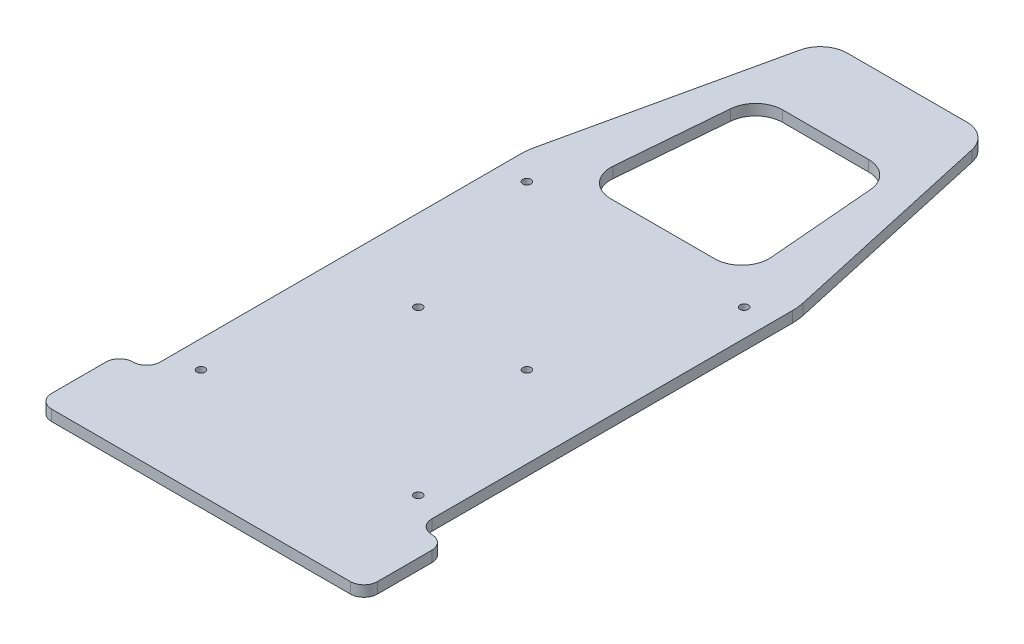
ISO-10303-21;
HEADER;
FILE_DESCRIPTION(('STEP AP214'),'2;1');
FILE_NAME('part.step','',(''),(''),'','','');
FILE_SCHEMA(('AUTOMOTIVE_DESIGN { 1 0 10303 214 1 1 1 1 }'));
ENDSEC;
DATA;
#1=APPLICATION_CONTEXT('core data for automotive mechanical design processes');
#2=APPLICATION_PROTOCOL_DEFINITION('international standard','automotive_design',2000,#1);
#3=PRODUCT_CONTEXT('',#1,'mechanical');
#4=PRODUCT('Part','Part','',(#3));
#5=PRODUCT_RELATED_PRODUCT_CATEGORY('part','',(#4));
#6=PRODUCT_DEFINITION_FORMATION('','',#4);
#7=PRODUCT_DEFINITION_CONTEXT('part definition',#1,'design');
#8=PRODUCT_DEFINITION('design','',#6,#7);
#9=PRODUCT_DEFINITION_SHAPE('','',#8);
#10=(LENGTH_UNIT() NAMED_UNIT(*) SI_UNIT(.MILLI.,.METRE.));
#11=(NAMED_UNIT(*) PLANE_ANGLE_UNIT() SI_UNIT($,.RADIAN.));
#12=(NAMED_UNIT(*) SI_UNIT($,.STERADIAN.) SOLID_ANGLE_UNIT());
#13=UNCERTAINTY_MEASURE_WITH_UNIT(LENGTH_MEASURE(1.E-05),#10,'distance_accuracy_value','');
#14=(GEOMETRIC_REPRESENTATION_CONTEXT(3) GLOBAL_UNCERTAINTY_ASSIGNED_CONTEXT((#13)) GLOBAL_UNIT_ASSIGNED_CONTEXT((#10,
#11,#12)) REPRESENTATION_CONTEXT('',''));
#15=CARTESIAN_POINT('',(0.,0.,0.));
#16=DIRECTION('',(0.,0.,1.));
#17=DIRECTION('',(1.,0.,0.));
#18=AXIS2_PLACEMENT_3D('',#15,#16,#17);
#19=CARTESIAN_POINT('',(0.,4.,0.));
#20=DIRECTION('',(0.,-1.,0.));
#21=DIRECTION('',(0.,0.,-1.));
#22=AXIS2_PLACEMENT_3D('',#19,#20,#21);
#23=PLANE('',#22);
#24=CARTESIAN_POINT('',(411.18527663098,4.,237.117267335242));
#25=DIRECTION('',(0.,1.,0.));
#26=DIRECTION('',(0.,0.,1.));
#27=AXIS2_PLACEMENT_3D('',#24,#25,#26);
#28=CIRCLE('',#27,1.50000000000009);
#29=CARTESIAN_POINT('',(411.18527663098,4.,238.617267335242));
#30=VERTEX_POINT('',#29);
#31=EDGE_CURVE('E438',#30,#30,#28,.T.);
#32=ORIENTED_EDGE('',*,*,#31,.F.);
#33=EDGE_LOOP('',(#32));
#34=FACE_BOUND('',#33,.T.);
#35=CARTESIAN_POINT('',(371.18527663098,4.,237.117267335242));
#36=DIRECTION('',(0.,1.,0.));
#37=DIRECTION('',(0.,0.,1.));
#38=AXIS2_PLACEMENT_3D('',#35,#36,#37);
#39=CIRCLE('',#38,1.50000000000002);
#40=CARTESIAN_POINT('',(371.18527663098,4.,238.617267335242));
#41=VERTEX_POINT('',#40);
#42=EDGE_CURVE('E432',#41,#41,#39,.T.);
#43=ORIENTED_EDGE('',*,*,#42,.F.);
#44=EDGE_LOOP('',(#43));
#45=FACE_BOUND('',#44,.T.);
#46=CARTESIAN_POINT('',(351.18527663098,4.,297.117267335242));
#47=DIRECTION('',(0.,1.,0.));
#48=DIRECTION('',(0.,0.,1.));
#49=AXIS2_PLACEMENT_3D('',#46,#47,#48);
#50=CIRCLE('',#49,1.50000000000002);
#51=CARTESIAN_POINT('',(351.18527663098,4.,298.617267335242));
#52=VERTEX_POINT('',#51);
#53=EDGE_CURVE('E426',#52,#52,#50,.T.);
#54=ORIENTED_EDGE('',*,*,#53,.F.);
#55=EDGE_LOOP('',(#54));
#56=FACE_BOUND('',#55,.T.);
#57=CARTESIAN_POINT('',(431.18527663098,4.,297.117267335242));
#58=DIRECTION('',(0.,1.,0.));
#59=DIRECTION('',(0.,0.,1.));
#60=AXIS2_PLACEMENT_3D('',#57,#58,#59);
#61=CIRCLE('',#60,1.49999999999997);
#62=CARTESIAN_POINT('',(431.18527663098,4.,298.617267335242));
#63=VERTEX_POINT('',#62);
#64=EDGE_CURVE('E420',#63,#63,#61,.T.);
#65=ORIENTED_EDGE('',*,*,#64,.F.);
#66=EDGE_LOOP('',(#65));
#67=FACE_BOUND('',#66,.T.);
#68=CARTESIAN_POINT('',(431.18527663098,4.,177.117267335242));
#69=DIRECTION('',(0.,1.,0.));
#70=DIRECTION('',(0.,0.,1.));
#71=AXIS2_PLACEMENT_3D('',#68,#69,#70);
#72=CIRCLE('',#71,1.49999999999996);
#73=CARTESIAN_POINT('',(431.18527663098,4.,178.617267335242));
#74=VERTEX_POINT('',#73);
#75=EDGE_CURVE('E415',#74,#74,#72,.T.);
#76=ORIENTED_EDGE('',*,*,#75,.F.);
#77=EDGE_LOOP('',(#76));
#78=FACE_BOUND('',#77,.T.);
#79=CARTESIAN_POINT('',(351.18527663098,4.,177.117267335242));
#80=DIRECTION('',(0.,1.,0.));
#81=DIRECTION('',(0.,0.,1.));
#82=AXIS2_PLACEMENT_3D('',#79,#80,#81);
#83=CIRCLE('',#82,1.50000000000002);
#84=CARTESIAN_POINT('',(351.18527663098,4.,178.617267335242));
#85=VERTEX_POINT('',#84);
#86=EDGE_CURVE('E370',#85,#85,#83,.T.);
#87=ORIENTED_EDGE('',*,*,#86,.F.);
#88=EDGE_LOOP('',(#87));
#89=FACE_BOUND('',#88,.T.);
#90=DIRECTION('',(-0.216930457818656,0.,-0.976187060183953));
#91=VECTOR('',#90,1.);
#92=CARTESIAN_POINT('',(441.18527663098,4.,167.117267335242));
#93=LINE('',#92,#91);
#94=CARTESIAN_POINT('',(440.709017834659,4.,164.974102751798));
#95=VERTEX_POINT('',#94);
#96=CARTESIAN_POINT('',(422.92543116916,4.,84.9479627570553));
#97=VERTEX_POINT('',#96);
#98=EDGE_CURVE('E237',#95,#97,#93,.T.);
#99=ORIENTED_EDGE('',*,*,#98,.T.);
#100=CARTESIAN_POINT('',(413.163560567321,4.,87.1172673352419));
#101=DIRECTION('',(0.,-1.,0.));
#102=DIRECTION('',(0.,0.,-1.));
#103=AXIS2_PLACEMENT_3D('',#100,#101,#102);
#104=CIRCLE('',#103,10.);
#105=CARTESIAN_POINT('',(413.163560567321,4.,77.1172673352419));
#106=VERTEX_POINT('',#105);
#107=EDGE_CURVE('E41',#97,#106,#104,.F.);
#108=ORIENTED_EDGE('',*,*,#107,.T.);
#109=DIRECTION('',(-1.,0.,0.));
#110=VECTOR('',#109,1.);
#111=CARTESIAN_POINT('',(361.18527663098,4.,77.1172673352419));
#112=LINE('',#111,#110);
#113=CARTESIAN_POINT('',(369.206992694638,4.,77.1172673352419));
#114=VERTEX_POINT('',#113);
#115=EDGE_CURVE('E240',#106,#114,#112,.T.);
#116=ORIENTED_EDGE('',*,*,#115,.T.);
#117=CARTESIAN_POINT('',(369.206992694638,4.,87.1172673352419));
#118=DIRECTION('',(0.,-1.,0.));
#119=DIRECTION('',(0.,0.,-1.));
#120=AXIS2_PLACEMENT_3D('',#117,#118,#119);
#121=CIRCLE('',#120,10.);
#122=CARTESIAN_POINT('',(359.445122092799,4.,84.9479627570553));
#123=VERTEX_POINT('',#122);
#124=EDGE_CURVE('E48',#114,#123,#121,.F.);
#125=ORIENTED_EDGE('',*,*,#124,.T.);
#126=DIRECTION('',(-0.216930457818656,0.,0.976187060183953));
#127=VECTOR('',#126,1.);
#128=CARTESIAN_POINT('',(341.18527663098,4.,167.117267335242));
#129=LINE('',#128,#127);
#130=CARTESIAN_POINT('',(341.661535427301,4.,164.974102751798));
#131=VERTEX_POINT('',#130);
#132=EDGE_CURVE('E363',#123,#131,#129,.T.);
#133=ORIENTED_EDGE('',*,*,#132,.T.);
#134=CARTESIAN_POINT('',(361.18527663098,4.,169.312711908171));
#135=DIRECTION('',(0.,-1.,0.));
#136=DIRECTION('',(0.,0.,-1.));
#137=AXIS2_PLACEMENT_3D('',#134,#135,#136);
#138=CIRCLE('',#137,20.);
#139=CARTESIAN_POINT('',(341.18527663098,4.,169.312711908171));
#140=VERTEX_POINT('',#139);
#141=EDGE_CURVE('E301',#131,#140,#138,.F.);
#142=ORIENTED_EDGE('',*,*,#141,.T.);
#143=DIRECTION('',(0.,0.,1.));
#144=VECTOR('',#143,1.);
#145=CARTESIAN_POINT('',(341.18527663098,4.,307.117267335242));
#146=LINE('',#145,#144);
#147=CARTESIAN_POINT('',(341.18527663098,4.,302.117267335242));
#148=VERTEX_POINT('',#147);
#149=EDGE_CURVE('E411',#140,#148,#146,.T.);
#150=ORIENTED_EDGE('',*,*,#149,.T.);
#151=CARTESIAN_POINT('',(336.18527663098,4.,302.117267335242));
#152=DIRECTION('',(0.,-1.,0.));
#153=DIRECTION('',(0.,0.,-1.));
#154=AXIS2_PLACEMENT_3D('',#151,#152,#153);
#155=CIRCLE('',#154,5.);
#156=CARTESIAN_POINT('',(336.18527663098,4.,307.117267335242));
#157=VERTEX_POINT('',#156);
#158=EDGE_CURVE('E282',#148,#157,#155,.T.);
#159=ORIENTED_EDGE('',*,*,#158,.T.);
#160=CARTESIAN_POINT('',(336.18527663098,4.,312.117267335242));
#161=DIRECTION('',(0.,-1.,0.));
#162=DIRECTION('',(0.,0.,-1.));
#163=AXIS2_PLACEMENT_3D('',#160,#161,#162);
#164=CIRCLE('',#163,5.);
#165=CARTESIAN_POINT('',(331.18527663098,4.,312.117267335242));
#166=VERTEX_POINT('',#165);
#167=EDGE_CURVE('E267',#157,#166,#164,.F.);
#168=ORIENTED_EDGE('',*,*,#167,.T.);
#169=DIRECTION('',(0.,0.,1.));
#170=VECTOR('',#169,1.);
#171=CARTESIAN_POINT('',(331.18527663098,4.,337.117267335242));
#172=LINE('',#171,#170);
#173=CARTESIAN_POINT('',(331.18527663098,4.,332.117267335242));
#174=VERTEX_POINT('',#173);
#175=EDGE_CURVE('E406',#166,#174,#172,.T.);
#176=ORIENTED_EDGE('',*,*,#175,.T.);
#177=CARTESIAN_POINT('',(336.18527663098,4.,332.117267335242));
#178=DIRECTION('',(0.,-1.,0.));
#179=DIRECTION('',(0.,0.,-1.));
#180=AXIS2_PLACEMENT_3D('',#177,#178,#179);
#181=CIRCLE('',#180,5.);
#182=CARTESIAN_POINT('',(336.18527663098,4.,337.117267335242));
#183=VERTEX_POINT('',#182);
#184=EDGE_CURVE('E265',#174,#183,#181,.F.);
#185=ORIENTED_EDGE('',*,*,#184,.T.);
#186=DIRECTION('',(1.,0.,0.));
#187=VECTOR('',#186,1.);
#188=CARTESIAN_POINT('',(391.18527663098,4.,337.117267335242));
#189=LINE('',#188,#187);
#190=CARTESIAN_POINT('',(446.18527663098,4.,337.117267335242));
#191=VERTEX_POINT('',#190);
#192=EDGE_CURVE('E401',#183,#191,#189,.T.);
#193=ORIENTED_EDGE('',*,*,#192,.T.);
#194=CARTESIAN_POINT('',(446.18527663098,4.,332.117267335242));
#195=DIRECTION('',(0.,-1.,0.));
#196=DIRECTION('',(0.,0.,-1.));
#197=AXIS2_PLACEMENT_3D('',#194,#195,#196);
#198=CIRCLE('',#197,5.);
#199=CARTESIAN_POINT('',(451.18527663098,4.,332.117267335242));
#200=VERTEX_POINT('',#199);
#201=EDGE_CURVE('E263',#191,#200,#198,.F.);
#202=ORIENTED_EDGE('',*,*,#201,.T.);
#203=DIRECTION('',(0.,0.,-1.));
#204=VECTOR('',#203,1.);
#205=CARTESIAN_POINT('',(451.18527663098,4.,337.117267335242));
#206=LINE('',#205,#204);
#207=CARTESIAN_POINT('',(451.18527663098,4.,312.117267335242));
#208=VERTEX_POINT('',#207);
#209=EDGE_CURVE('E399',#200,#208,#206,.T.);
#210=ORIENTED_EDGE('',*,*,#209,.T.);
#211=CARTESIAN_POINT('',(446.18527663098,4.,312.117267335242));
#212=DIRECTION('',(0.,-1.,0.));
#213=DIRECTION('',(0.,0.,-1.));
#214=AXIS2_PLACEMENT_3D('',#211,#212,#213);
#215=CIRCLE('',#214,5.);
#216=CARTESIAN_POINT('',(446.18527663098,4.,307.117267335242));
#217=VERTEX_POINT('',#216);
#218=EDGE_CURVE('E261',#208,#217,#215,.F.);
#219=ORIENTED_EDGE('',*,*,#218,.T.);
#220=CARTESIAN_POINT('',(446.18527663098,4.,302.117267335242));
#221=DIRECTION('',(0.,-1.,0.));
#222=DIRECTION('',(0.,0.,-1.));
#223=AXIS2_PLACEMENT_3D('',#220,#221,#222);
#224=CIRCLE('',#223,5.);
#225=CARTESIAN_POINT('',(441.18527663098,4.,302.117267335242));
#226=VERTEX_POINT('',#225);
#227=EDGE_CURVE('E219',#217,#226,#224,.T.);
#228=ORIENTED_EDGE('',*,*,#227,.T.);
#229=DIRECTION('',(0.,0.,-1.));
#230=VECTOR('',#229,1.);
#231=CARTESIAN_POINT('',(441.18527663098,4.,307.117267335242));
#232=LINE('',#231,#230);
#233=CARTESIAN_POINT('',(441.18527663098,4.,169.312711908171));
#234=VERTEX_POINT('',#233);
#235=EDGE_CURVE('E229',#226,#234,#232,.T.);
#236=ORIENTED_EDGE('',*,*,#235,.T.);
#237=CARTESIAN_POINT('',(421.18527663098,4.,169.312711908171));
#238=DIRECTION('',(0.,-1.,0.));
#239=DIRECTION('',(0.,0.,-1.));
#240=AXIS2_PLACEMENT_3D('',#237,#238,#239);
#241=CIRCLE('',#240,20.);
#242=EDGE_CURVE('E299',#234,#95,#241,.F.);
#243=ORIENTED_EDGE('',*,*,#242,.T.);
#244=EDGE_LOOP('',(#99,#108,#116,#125,#133,#142,#150,#159,#168,#176,#185,#193,#202,#210,#219,
#228,#236,#243));
#245=FACE_BOUND('',#244,.T.);
#246=DIRECTION('',(-1.,0.,0.));
#247=VECTOR('',#246,1.);
#248=CARTESIAN_POINT('',(366.18527663098,4.,107.117267335242));
#249=LINE('',#248,#247);
#250=CARTESIAN_POINT('',(406.983947815319,4.,107.117267335242));
#251=VERTEX_POINT('',#250);
#252=CARTESIAN_POINT('',(375.38660544664,4.,107.117267335242));
#253=VERTEX_POINT('',#252);
#254=EDGE_CURVE('E450',#251,#253,#249,.T.);
#255=ORIENTED_EDGE('',*,*,#254,.F.);
#256=CARTESIAN_POINT('',(406.983947815319,4.,117.117267335242));
#257=DIRECTION('',(0.,-1.,0.));
#258=DIRECTION('',(0.,0.,-1.));
#259=AXIS2_PLACEMENT_3D('',#256,#257,#258);
#260=CIRCLE('',#259,10.);
#261=CARTESIAN_POINT('',(416.949405397768,4.,116.286812536705));
#262=VERTEX_POINT('',#261);
#263=EDGE_CURVE('E334',#251,#262,#260,.T.);
#264=ORIENTED_EDGE('',*,*,#263,.T.);
#265=DIRECTION('',(-0.0830454798537391,0.,-0.99654575824488));
#266=VECTOR('',#265,1.);
#267=CARTESIAN_POINT('',(421.18527663098,4.,167.117267335242));
#268=LINE('',#267,#266);
#269=CARTESIAN_POINT('',(420.282738731102,4.,156.286812536705));
#270=VERTEX_POINT('',#269);
#271=EDGE_CURVE('E444',#270,#262,#268,.T.);
#272=ORIENTED_EDGE('',*,*,#271,.F.);
#273=CARTESIAN_POINT('',(410.317281148653,4.,157.117267335242));
#274=DIRECTION('',(0.,-1.,0.));
#275=DIRECTION('',(0.,0.,-1.));
#276=AXIS2_PLACEMENT_3D('',#273,#274,#275);
#277=CIRCLE('',#276,10.);
#278=CARTESIAN_POINT('',(410.317281148653,4.,167.117267335242));
#279=VERTEX_POINT('',#278);
#280=EDGE_CURVE('E338',#270,#279,#277,.T.);
#281=ORIENTED_EDGE('',*,*,#280,.T.);
#282=DIRECTION('',(1.,0.,0.));
#283=VECTOR('',#282,1.);
#284=CARTESIAN_POINT('',(421.18527663098,4.,167.117267335242));
#285=LINE('',#284,#283);
#286=CARTESIAN_POINT('',(372.053272113307,4.,167.117267335242));
#287=VERTEX_POINT('',#286);
#288=EDGE_CURVE('E461',#287,#279,#285,.T.);
#289=ORIENTED_EDGE('',*,*,#288,.F.);
#290=CARTESIAN_POINT('',(372.053272113307,4.,157.117267335242));
#291=DIRECTION('',(0.,-1.,0.));
#292=DIRECTION('',(0.,0.,-1.));
#293=AXIS2_PLACEMENT_3D('',#290,#291,#292);
#294=CIRCLE('',#293,10.);
#295=CARTESIAN_POINT('',(362.087814530858,4.,156.286812536705));
#296=VERTEX_POINT('',#295);
#297=EDGE_CURVE('E342',#287,#296,#294,.T.);
#298=ORIENTED_EDGE('',*,*,#297,.T.);
#299=DIRECTION('',(-0.0830454798537391,0.,0.99654575824488));
#300=VECTOR('',#299,1.);
#301=CARTESIAN_POINT('',(361.18527663098,4.,167.117267335242));
#302=LINE('',#301,#300);
#303=CARTESIAN_POINT('',(365.421147864191,4.,116.286812536705));
#304=VERTEX_POINT('',#303);
#305=EDGE_CURVE('E464',#304,#296,#302,.T.);
#306=ORIENTED_EDGE('',*,*,#305,.F.);
#307=CARTESIAN_POINT('',(375.38660544664,4.,117.117267335242));
#308=DIRECTION('',(0.,-1.,0.));
#309=DIRECTION('',(0.,0.,-1.));
#310=AXIS2_PLACEMENT_3D('',#307,#308,#309);
#311=CIRCLE('',#310,10.);
#312=EDGE_CURVE('E330',#304,#253,#311,.T.);
#313=ORIENTED_EDGE('',*,*,#312,.T.);
#314=EDGE_LOOP('',(#255,#264,#272,#281,#289,#298,#306,#313));
#315=FACE_BOUND('',#314,.T.);
#316=ADVANCED_FACE('F33',(#34,#45,#56,#67,#78,#89,#245,#315),#23,.F.);
#317=CARTESIAN_POINT('',(0.,0.,0.));
#318=DIRECTION('',(0.,-1.,0.));
#319=DIRECTION('',(0.,0.,-1.));
#320=AXIS2_PLACEMENT_3D('',#317,#318,#319);
#321=PLANE('',#320);
#322=CARTESIAN_POINT('',(371.18527663098,0.,237.117267335242));
#323=DIRECTION('',(0.,1.,0.));
#324=DIRECTION('',(0.,0.,1.));
#325=AXIS2_PLACEMENT_3D('',#322,#323,#324);
#326=CIRCLE('',#325,1.50000000000002);
#327=CARTESIAN_POINT('',(371.18527663098,0.,238.617267335242));
#328=VERTEX_POINT('',#327);
#329=EDGE_CURVE('E435',#328,#328,#326,.T.);
#330=ORIENTED_EDGE('',*,*,#329,.T.);
#331=EDGE_LOOP('',(#330));
#332=FACE_BOUND('',#331,.T.);
#333=CARTESIAN_POINT('',(431.18527663098,0.,297.117267335242));
#334=DIRECTION('',(0.,1.,0.));
#335=DIRECTION('',(0.,0.,1.));
#336=AXIS2_PLACEMENT_3D('',#333,#334,#335);
#337=CIRCLE('',#336,1.49999999999997);
#338=CARTESIAN_POINT('',(431.18527663098,0.,298.617267335242));
#339=VERTEX_POINT('',#338);
#340=EDGE_CURVE('E423',#339,#339,#337,.T.);
#341=ORIENTED_EDGE('',*,*,#340,.T.);
#342=EDGE_LOOP('',(#341));
#343=FACE_BOUND('',#342,.T.);
#344=CARTESIAN_POINT('',(351.18527663098,0.,177.117267335242));
#345=DIRECTION('',(0.,1.,0.));
#346=DIRECTION('',(0.,0.,1.));
#347=AXIS2_PLACEMENT_3D('',#344,#345,#346);
#348=CIRCLE('',#347,1.50000000000002);
#349=CARTESIAN_POINT('',(351.18527663098,0.,178.617267335242));
#350=VERTEX_POINT('',#349);
#351=EDGE_CURVE('E375',#350,#350,#348,.T.);
#352=ORIENTED_EDGE('',*,*,#351,.T.);
#353=EDGE_LOOP('',(#352));
#354=FACE_BOUND('',#353,.T.);
#355=DIRECTION('',(-1.,0.,0.));
#356=VECTOR('',#355,1.);
#357=CARTESIAN_POINT('',(361.18527663098,0.,77.1172673352419));
#358=LINE('',#357,#356);
#359=CARTESIAN_POINT('',(413.163560567321,0.,77.1172673352419));
#360=VERTEX_POINT('',#359);
#361=CARTESIAN_POINT('',(369.206992694638,0.,77.1172673352419));
#362=VERTEX_POINT('',#361);
#363=EDGE_CURVE('E367',#360,#362,#358,.T.);
#364=ORIENTED_EDGE('',*,*,#363,.F.);
#365=CARTESIAN_POINT('',(413.163560567321,0.,87.1172673352419));
#366=DIRECTION('',(0.,-1.,0.));
#367=DIRECTION('',(0.,0.,-1.));
#368=AXIS2_PLACEMENT_3D('',#365,#366,#367);
#369=CIRCLE('',#368,10.);
#370=CARTESIAN_POINT('',(422.92543116916,0.,84.9479627570553));
#371=VERTEX_POINT('',#370);
#372=EDGE_CURVE('E351',#360,#371,#369,.T.);
#373=ORIENTED_EDGE('',*,*,#372,.T.);
#374=DIRECTION('',(-0.216930457818656,0.,-0.976187060183953));
#375=VECTOR('',#374,1.);
#376=CARTESIAN_POINT('',(441.18527663098,0.,167.117267335242));
#377=LINE('',#376,#375);
#378=CARTESIAN_POINT('',(440.709017834659,0.,164.974102751798));
#379=VERTEX_POINT('',#378);
#380=EDGE_CURVE('E366',#379,#371,#377,.T.);
#381=ORIENTED_EDGE('',*,*,#380,.F.);
#382=CARTESIAN_POINT('',(421.18527663098,0.,169.312711908171));
#383=DIRECTION('',(0.,-1.,0.));
#384=DIRECTION('',(0.,0.,-1.));
#385=AXIS2_PLACEMENT_3D('',#382,#383,#384);
#386=CIRCLE('',#385,20.);
#387=CARTESIAN_POINT('',(441.18527663098,0.,169.312711908171));
#388=VERTEX_POINT('',#387);
#389=EDGE_CURVE('E236',#379,#388,#386,.T.);
#390=ORIENTED_EDGE('',*,*,#389,.T.);
#391=DIRECTION('',(0.,0.,-1.));
#392=VECTOR('',#391,1.);
#393=CARTESIAN_POINT('',(441.18527663098,0.,307.117267335242));
#394=LINE('',#393,#392);
#395=CARTESIAN_POINT('',(441.18527663098,0.,302.117267335242));
#396=VERTEX_POINT('',#395);
#397=EDGE_CURVE('E226',#396,#388,#394,.T.);
#398=ORIENTED_EDGE('',*,*,#397,.F.);
#399=CARTESIAN_POINT('',(446.18527663098,0.,302.117267335242));
#400=DIRECTION('',(0.,-1.,0.));
#401=DIRECTION('',(0.,0.,-1.));
#402=AXIS2_PLACEMENT_3D('',#399,#400,#401);
#403=CIRCLE('',#402,5.);
#404=CARTESIAN_POINT('',(446.18527663098,0.,307.117267335242));
#405=VERTEX_POINT('',#404);
#406=EDGE_CURVE('E209',#396,#405,#403,.F.);
#407=ORIENTED_EDGE('',*,*,#406,.T.);
#408=CARTESIAN_POINT('',(446.18527663098,0.,312.117267335242));
#409=DIRECTION('',(0.,-1.,0.));
#410=DIRECTION('',(0.,0.,-1.));
#411=AXIS2_PLACEMENT_3D('',#408,#409,#410);
#412=CIRCLE('',#411,5.);
#413=CARTESIAN_POINT('',(451.18527663098,0.,312.117267335242));
#414=VERTEX_POINT('',#413);
#415=EDGE_CURVE('E253',#405,#414,#412,.T.);
#416=ORIENTED_EDGE('',*,*,#415,.T.);
#417=DIRECTION('',(0.,0.,-1.));
#418=VECTOR('',#417,1.);
#419=CARTESIAN_POINT('',(451.18527663098,0.,337.117267335242));
#420=LINE('',#419,#418);
#421=CARTESIAN_POINT('',(451.18527663098,0.,332.117267335242));
#422=VERTEX_POINT('',#421);
#423=EDGE_CURVE('E238',#422,#414,#420,.T.);
#424=ORIENTED_EDGE('',*,*,#423,.F.);
#425=CARTESIAN_POINT('',(446.18527663098,0.,332.117267335242));
#426=DIRECTION('',(0.,-1.,0.));
#427=DIRECTION('',(0.,0.,-1.));
#428=AXIS2_PLACEMENT_3D('',#425,#426,#427);
#429=CIRCLE('',#428,5.);
#430=CARTESIAN_POINT('',(446.18527663098,0.,337.117267335242));
#431=VERTEX_POINT('',#430);
#432=EDGE_CURVE('E255',#422,#431,#429,.T.);
#433=ORIENTED_EDGE('',*,*,#432,.T.);
#434=DIRECTION('',(1.,0.,0.));
#435=VECTOR('',#434,1.);
#436=CARTESIAN_POINT('',(391.18527663098,0.,337.117267335242));
#437=LINE('',#436,#435);
#438=CARTESIAN_POINT('',(336.18527663098,0.,337.117267335242));
#439=VERTEX_POINT('',#438);
#440=EDGE_CURVE('E243',#439,#431,#437,.T.);
#441=ORIENTED_EDGE('',*,*,#440,.F.);
#442=CARTESIAN_POINT('',(336.18527663098,0.,332.117267335242));
#443=DIRECTION('',(0.,-1.,0.));
#444=DIRECTION('',(0.,0.,-1.));
#445=AXIS2_PLACEMENT_3D('',#442,#443,#444);
#446=CIRCLE('',#445,5.);
#447=CARTESIAN_POINT('',(331.18527663098,0.,332.117267335242));
#448=VERTEX_POINT('',#447);
#449=EDGE_CURVE('E257',#439,#448,#446,.T.);
#450=ORIENTED_EDGE('',*,*,#449,.T.);
#451=DIRECTION('',(0.,0.,1.));
#452=VECTOR('',#451,1.);
#453=CARTESIAN_POINT('',(331.18527663098,0.,337.117267335242));
#454=LINE('',#453,#452);
#455=CARTESIAN_POINT('',(331.18527663098,0.,312.117267335242));
#456=VERTEX_POINT('',#455);
#457=EDGE_CURVE('E383',#456,#448,#454,.T.);
#458=ORIENTED_EDGE('',*,*,#457,.F.);
#459=CARTESIAN_POINT('',(336.18527663098,0.,312.117267335242));
#460=DIRECTION('',(0.,-1.,0.));
#461=DIRECTION('',(0.,0.,-1.));
#462=AXIS2_PLACEMENT_3D('',#459,#460,#461);
#463=CIRCLE('',#462,5.);
#464=CARTESIAN_POINT('',(336.18527663098,0.,307.117267335242));
#465=VERTEX_POINT('',#464);
#466=EDGE_CURVE('E259',#456,#465,#463,.T.);
#467=ORIENTED_EDGE('',*,*,#466,.T.);
#468=CARTESIAN_POINT('',(336.18527663098,0.,302.117267335242));
#469=DIRECTION('',(0.,-1.,0.));
#470=DIRECTION('',(0.,0.,-1.));
#471=AXIS2_PLACEMENT_3D('',#468,#469,#470);
#472=CIRCLE('',#471,5.);
#473=CARTESIAN_POINT('',(341.18527663098,0.,302.117267335242));
#474=VERTEX_POINT('',#473);
#475=EDGE_CURVE('E279',#465,#474,#472,.F.);
#476=ORIENTED_EDGE('',*,*,#475,.T.);
#477=DIRECTION('',(0.,0.,1.));
#478=VECTOR('',#477,1.);
#479=CARTESIAN_POINT('',(341.18527663098,0.,307.117267335242));
#480=LINE('',#479,#478);
#481=CARTESIAN_POINT('',(341.18527663098,0.,169.312711908171));
#482=VERTEX_POINT('',#481);
#483=EDGE_CURVE('E381',#482,#474,#480,.T.);
#484=ORIENTED_EDGE('',*,*,#483,.F.);
#485=CARTESIAN_POINT('',(361.18527663098,0.,169.312711908171));
#486=DIRECTION('',(0.,-1.,0.));
#487=DIRECTION('',(0.,0.,-1.));
#488=AXIS2_PLACEMENT_3D('',#485,#486,#487);
#489=CIRCLE('',#488,20.);
#490=CARTESIAN_POINT('',(341.661535427301,0.,164.974102751798));
#491=VERTEX_POINT('',#490);
#492=EDGE_CURVE('E293',#482,#491,#489,.T.);
#493=ORIENTED_EDGE('',*,*,#492,.T.);
#494=DIRECTION('',(-0.216930457818656,0.,0.976187060183953));
#495=VECTOR('',#494,1.);
#496=CARTESIAN_POINT('',(341.18527663098,0.,167.117267335242));
#497=LINE('',#496,#495);
#498=CARTESIAN_POINT('',(359.445122092799,0.,84.9479627570553));
#499=VERTEX_POINT('',#498);
#500=EDGE_CURVE('E372',#499,#491,#497,.T.);
#501=ORIENTED_EDGE('',*,*,#500,.F.);
#502=CARTESIAN_POINT('',(369.206992694638,0.,87.1172673352419));
#503=DIRECTION('',(0.,-1.,0.));
#504=DIRECTION('',(0.,0.,-1.));
#505=AXIS2_PLACEMENT_3D('',#502,#503,#504);
#506=CIRCLE('',#505,10.);
#507=EDGE_CURVE('E349',#499,#362,#506,.T.);
#508=ORIENTED_EDGE('',*,*,#507,.T.);
#509=EDGE_LOOP('',(#364,#373,#381,#390,#398,#407,#416,#424,#433,#441,#450,#458,#467,#476,#484,
#493,#501,#508));
#510=FACE_BOUND('',#509,.T.);
#511=CARTESIAN_POINT('',(431.18527663098,0.,177.117267335242));
#512=DIRECTION('',(0.,1.,0.));
#513=DIRECTION('',(0.,0.,1.));
#514=AXIS2_PLACEMENT_3D('',#511,#512,#513);
#515=CIRCLE('',#514,1.49999999999996);
#516=CARTESIAN_POINT('',(431.18527663098,0.,178.617267335242));
#517=VERTEX_POINT('',#516);
#518=EDGE_CURVE('E417',#517,#517,#515,.T.);
#519=ORIENTED_EDGE('',*,*,#518,.T.);
#520=EDGE_LOOP('',(#519));
#521=FACE_BOUND('',#520,.T.);
#522=CARTESIAN_POINT('',(351.18527663098,0.,297.117267335242));
#523=DIRECTION('',(0.,1.,0.));
#524=DIRECTION('',(0.,0.,1.));
#525=AXIS2_PLACEMENT_3D('',#522,#523,#524);
#526=CIRCLE('',#525,1.50000000000002);
#527=CARTESIAN_POINT('',(351.18527663098,0.,298.617267335242));
#528=VERTEX_POINT('',#527);
#529=EDGE_CURVE('E429',#528,#528,#526,.T.);
#530=ORIENTED_EDGE('',*,*,#529,.T.);
#531=EDGE_LOOP('',(#530));
#532=FACE_BOUND('',#531,.T.);
#533=CARTESIAN_POINT('',(411.18527663098,0.,237.117267335242));
#534=DIRECTION('',(0.,1.,0.));
#535=DIRECTION('',(0.,0.,1.));
#536=AXIS2_PLACEMENT_3D('',#533,#534,#535);
#537=CIRCLE('',#536,1.50000000000009);
#538=CARTESIAN_POINT('',(411.18527663098,0.,238.617267335242));
#539=VERTEX_POINT('',#538);
#540=EDGE_CURVE('E441',#539,#539,#537,.T.);
#541=ORIENTED_EDGE('',*,*,#540,.T.);
#542=EDGE_LOOP('',(#541));
#543=FACE_BOUND('',#542,.T.);
#544=DIRECTION('',(1.,0.,0.));
#545=VECTOR('',#544,1.);
#546=CARTESIAN_POINT('',(421.18527663098,0.,167.117267335242));
#547=LINE('',#546,#545);
#548=CARTESIAN_POINT('',(372.053272113307,0.,167.117267335242));
#549=VERTEX_POINT('',#548);
#550=CARTESIAN_POINT('',(410.317281148653,0.,167.117267335242));
#551=VERTEX_POINT('',#550);
#552=EDGE_CURVE('E451',#549,#551,#547,.T.);
#553=ORIENTED_EDGE('',*,*,#552,.T.);
#554=CARTESIAN_POINT('',(410.317281148653,0.,157.117267335242));
#555=DIRECTION('',(0.,-1.,0.));
#556=DIRECTION('',(0.,0.,-1.));
#557=AXIS2_PLACEMENT_3D('',#554,#555,#556);
#558=CIRCLE('',#557,10.);
#559=CARTESIAN_POINT('',(420.282738731102,0.,156.286812536705));
#560=VERTEX_POINT('',#559);
#561=EDGE_CURVE('E336',#551,#560,#558,.F.);
#562=ORIENTED_EDGE('',*,*,#561,.T.);
#563=DIRECTION('',(-0.0830454798537391,0.,-0.99654575824488));
#564=VECTOR('',#563,1.);
#565=CARTESIAN_POINT('',(421.18527663098,0.,167.117267335242));
#566=LINE('',#565,#564);
#567=CARTESIAN_POINT('',(416.949405397768,0.,116.286812536705));
#568=VERTEX_POINT('',#567);
#569=EDGE_CURVE('E447',#560,#568,#566,.T.);
#570=ORIENTED_EDGE('',*,*,#569,.T.);
#571=CARTESIAN_POINT('',(406.983947815319,0.,117.117267335242));
#572=DIRECTION('',(0.,-1.,0.));
#573=DIRECTION('',(0.,0.,-1.));
#574=AXIS2_PLACEMENT_3D('',#571,#572,#573);
#575=CIRCLE('',#574,10.);
#576=CARTESIAN_POINT('',(406.983947815319,0.,107.117267335242));
#577=VERTEX_POINT('',#576);
#578=EDGE_CURVE('E332',#568,#577,#575,.F.);
#579=ORIENTED_EDGE('',*,*,#578,.T.);
#580=DIRECTION('',(-1.,0.,0.));
#581=VECTOR('',#580,1.);
#582=CARTESIAN_POINT('',(366.18527663098,0.,107.117267335242));
#583=LINE('',#582,#581);
#584=CARTESIAN_POINT('',(375.38660544664,0.,107.117267335242));
#585=VERTEX_POINT('',#584);
#586=EDGE_CURVE('E286',#577,#585,#583,.T.);
#587=ORIENTED_EDGE('',*,*,#586,.T.);
#588=CARTESIAN_POINT('',(375.38660544664,0.,117.117267335242));
#589=DIRECTION('',(0.,-1.,0.));
#590=DIRECTION('',(0.,0.,-1.));
#591=AXIS2_PLACEMENT_3D('',#588,#589,#590);
#592=CIRCLE('',#591,10.);
#593=CARTESIAN_POINT('',(365.421147864191,0.,116.286812536705));
#594=VERTEX_POINT('',#593);
#595=EDGE_CURVE('E328',#585,#594,#592,.F.);
#596=ORIENTED_EDGE('',*,*,#595,.T.);
#597=DIRECTION('',(-0.0830454798537391,0.,0.99654575824488));
#598=VECTOR('',#597,1.);
#599=CARTESIAN_POINT('',(361.18527663098,0.,167.117267335242));
#600=LINE('',#599,#598);
#601=CARTESIAN_POINT('',(362.087814530858,0.,156.286812536705));
#602=VERTEX_POINT('',#601);
#603=EDGE_CURVE('E454',#594,#602,#600,.T.);
#604=ORIENTED_EDGE('',*,*,#603,.T.);
#605=CARTESIAN_POINT('',(372.053272113307,0.,157.117267335242));
#606=DIRECTION('',(0.,-1.,0.));
#607=DIRECTION('',(0.,0.,-1.));
#608=AXIS2_PLACEMENT_3D('',#605,#606,#607);
#609=CIRCLE('',#608,10.);
#610=EDGE_CURVE('E340',#602,#549,#609,.F.);
#611=ORIENTED_EDGE('',*,*,#610,.T.);
#612=EDGE_LOOP('',(#553,#562,#570,#579,#587,#596,#604,#611));
#613=FACE_BOUND('',#612,.T.);
#614=ADVANCED_FACE('F233',(#332,#343,#354,#510,#521,#532,#543,#613),#321,.T.);
#615=CARTESIAN_POINT('',(441.18527663098,4.,167.117267335242));
#616=DIRECTION('',(-0.976187060183953,0.,0.216930457818656));
#617=DIRECTION('',(0.216930457818656,0.,0.976187060183953));
#618=AXIS2_PLACEMENT_3D('',#615,#616,#617);
#619=PLANE('',#618);
#620=ORIENTED_EDGE('',*,*,#380,.T.);
#621=DIRECTION('',(0.,-1.,0.));
#622=VECTOR('',#621,1.);
#623=CARTESIAN_POINT('',(422.92543116916,4.,84.9479627570553));
#624=LINE('',#623,#622);
#625=EDGE_CURVE('E56',#371,#97,#624,.F.);
#626=ORIENTED_EDGE('',*,*,#625,.T.);
#627=ORIENTED_EDGE('',*,*,#98,.F.);
#628=DIRECTION('',(0.,-1.,0.));
#629=VECTOR('',#628,1.);
#630=CARTESIAN_POINT('',(440.709017834659,4.,164.974102751798));
#631=LINE('',#630,#629);
#632=EDGE_CURVE('E303',#95,#379,#631,.T.);
#633=ORIENTED_EDGE('',*,*,#632,.T.);
#634=EDGE_LOOP('',(#620,#626,#627,#633));
#635=FACE_BOUND('',#634,.T.);
#636=ADVANCED_FACE('F368',(#635),#619,.F.);
#637=CARTESIAN_POINT('',(361.18527663098,4.,77.1172673352419));
#638=DIRECTION('',(0.,0.,1.));
#639=DIRECTION('',(1.,0.,0.));
#640=AXIS2_PLACEMENT_3D('',#637,#638,#639);
#641=PLANE('',#640);
#642=ORIENTED_EDGE('',*,*,#115,.F.);
#643=DIRECTION('',(0.,-1.,0.));
#644=VECTOR('',#643,1.);
#645=CARTESIAN_POINT('',(413.163560567321,4.,77.1172673352419));
#646=LINE('',#645,#644);
#647=EDGE_CURVE('E346',#106,#360,#646,.T.);
#648=ORIENTED_EDGE('',*,*,#647,.T.);
#649=ORIENTED_EDGE('',*,*,#363,.T.);
#650=DIRECTION('',(0.,-1.,0.));
#651=VECTOR('',#650,1.);
#652=CARTESIAN_POINT('',(369.206992694638,4.,77.1172673352419));
#653=LINE('',#652,#651);
#654=EDGE_CURVE('E344',#362,#114,#653,.F.);
#655=ORIENTED_EDGE('',*,*,#654,.T.);
#656=EDGE_LOOP('',(#642,#648,#649,#655));
#657=FACE_BOUND('',#656,.T.);
#658=ADVANCED_FACE('F360',(#657),#641,.F.);
#659=CARTESIAN_POINT('',(341.18527663098,4.,167.117267335242));
#660=DIRECTION('',(0.976187060183953,0.,0.216930457818656));
#661=DIRECTION('',(0.216930457818656,0.,-0.976187060183953));
#662=AXIS2_PLACEMENT_3D('',#659,#660,#661);
#663=PLANE('',#662);
#664=ORIENTED_EDGE('',*,*,#132,.F.);
#665=DIRECTION('',(0.,-1.,0.));
#666=VECTOR('',#665,1.);
#667=CARTESIAN_POINT('',(359.445122092799,4.,84.9479627570553));
#668=LINE('',#667,#666);
#669=EDGE_CURVE('E11',#123,#499,#668,.T.);
#670=ORIENTED_EDGE('',*,*,#669,.T.);
#671=ORIENTED_EDGE('',*,*,#500,.T.);
#672=DIRECTION('',(0.,-1.,0.));
#673=VECTOR('',#672,1.);
#674=CARTESIAN_POINT('',(341.661535427301,4.,164.974102751798));
#675=LINE('',#674,#673);
#676=EDGE_CURVE('E296',#491,#131,#675,.F.);
#677=ORIENTED_EDGE('',*,*,#676,.T.);
#678=EDGE_LOOP('',(#664,#670,#671,#677));
#679=FACE_BOUND('',#678,.T.);
#680=ADVANCED_FACE('F532',(#679),#663,.F.);
#681=CARTESIAN_POINT('',(341.18527663098,4.,307.117267335242));
#682=DIRECTION('',(1.,0.,0.));
#683=DIRECTION('',(0.,0.,-1.));
#684=AXIS2_PLACEMENT_3D('',#681,#682,#683);
#685=PLANE('',#684);
#686=ORIENTED_EDGE('',*,*,#149,.F.);
#687=DIRECTION('',(0.,-1.,0.));
#688=VECTOR('',#687,1.);
#689=CARTESIAN_POINT('',(341.18527663098,4.,169.312711908171));
#690=LINE('',#689,#688);
#691=EDGE_CURVE('E284',#140,#482,#690,.T.);
#692=ORIENTED_EDGE('',*,*,#691,.T.);
#693=ORIENTED_EDGE('',*,*,#483,.T.);
#694=DIRECTION('',(0.,-1.,0.));
#695=VECTOR('',#694,1.);
#696=CARTESIAN_POINT('',(341.18527663098,4.,302.117267335242));
#697=LINE('',#696,#695);
#698=EDGE_CURVE('E230',#474,#148,#697,.F.);
#699=ORIENTED_EDGE('',*,*,#698,.T.);
#700=EDGE_LOOP('',(#686,#692,#693,#699));
#701=FACE_BOUND('',#700,.T.);
#702=ADVANCED_FACE('F528',(#701),#685,.F.);
#703=CARTESIAN_POINT('',(331.18527663098,4.,337.117267335242));
#704=DIRECTION('',(1.,0.,0.));
#705=DIRECTION('',(0.,0.,-1.));
#706=AXIS2_PLACEMENT_3D('',#703,#704,#705);
#707=PLANE('',#706);
#708=ORIENTED_EDGE('',*,*,#175,.F.);
#709=DIRECTION('',(0.,-1.,0.));
#710=VECTOR('',#709,1.);
#711=CARTESIAN_POINT('',(331.18527663098,4.,312.117267335242));
#712=LINE('',#711,#710);
#713=EDGE_CURVE('E251',#166,#456,#712,.T.);
#714=ORIENTED_EDGE('',*,*,#713,.T.);
#715=ORIENTED_EDGE('',*,*,#457,.T.);
#716=DIRECTION('',(0.,-1.,0.));
#717=VECTOR('',#716,1.);
#718=CARTESIAN_POINT('',(331.18527663098,4.,332.117267335242));
#719=LINE('',#718,#717);
#720=EDGE_CURVE('E249',#448,#174,#719,.F.);
#721=ORIENTED_EDGE('',*,*,#720,.T.);
#722=EDGE_LOOP('',(#708,#714,#715,#721));
#723=FACE_BOUND('',#722,.T.);
#724=ADVANCED_FACE('F525',(#723),#707,.F.);
#725=CARTESIAN_POINT('',(391.18527663098,4.,337.117267335242));
#726=DIRECTION('',(0.,0.,-1.));
#727=DIRECTION('',(-1.,0.,0.));
#728=AXIS2_PLACEMENT_3D('',#725,#726,#727);
#729=PLANE('',#728);
#730=ORIENTED_EDGE('',*,*,#192,.F.);
#731=DIRECTION('',(0.,-1.,0.));
#732=VECTOR('',#731,1.);
#733=CARTESIAN_POINT('',(336.18527663098,4.,337.117267335242));
#734=LINE('',#733,#732);
#735=EDGE_CURVE('E271',#183,#439,#734,.T.);
#736=ORIENTED_EDGE('',*,*,#735,.T.);
#737=ORIENTED_EDGE('',*,*,#440,.T.);
#738=DIRECTION('',(0.,-1.,0.));
#739=VECTOR('',#738,1.);
#740=CARTESIAN_POINT('',(446.18527663098,4.,337.117267335242));
#741=LINE('',#740,#739);
#742=EDGE_CURVE('E269',#431,#191,#741,.F.);
#743=ORIENTED_EDGE('',*,*,#742,.T.);
#744=EDGE_LOOP('',(#730,#736,#737,#743));
#745=FACE_BOUND('',#744,.T.);
#746=ADVANCED_FACE('F390',(#745),#729,.F.);
#747=CARTESIAN_POINT('',(451.18527663098,4.,337.117267335242));
#748=DIRECTION('',(-1.,0.,0.));
#749=DIRECTION('',(0.,0.,1.));
#750=AXIS2_PLACEMENT_3D('',#747,#748,#749);
#751=PLANE('',#750);
#752=ORIENTED_EDGE('',*,*,#209,.F.);
#753=DIRECTION('',(0.,-1.,0.));
#754=VECTOR('',#753,1.);
#755=CARTESIAN_POINT('',(451.18527663098,4.,332.117267335242));
#756=LINE('',#755,#754);
#757=EDGE_CURVE('E220',#200,#422,#756,.T.);
#758=ORIENTED_EDGE('',*,*,#757,.T.);
#759=ORIENTED_EDGE('',*,*,#423,.T.);
#760=DIRECTION('',(0.,-1.,0.));
#761=VECTOR('',#760,1.);
#762=CARTESIAN_POINT('',(451.18527663098,4.,312.117267335242));
#763=LINE('',#762,#761);
#764=EDGE_CURVE('E274',#414,#208,#763,.F.);
#765=ORIENTED_EDGE('',*,*,#764,.T.);
#766=EDGE_LOOP('',(#752,#758,#759,#765));
#767=FACE_BOUND('',#766,.T.);
#768=ADVANCED_FACE('F403',(#767),#751,.F.);
#769=CARTESIAN_POINT('',(441.18527663098,4.,307.117267335242));
#770=DIRECTION('',(-1.,0.,0.));
#771=DIRECTION('',(0.,0.,1.));
#772=AXIS2_PLACEMENT_3D('',#769,#770,#771);
#773=PLANE('',#772);
#774=ORIENTED_EDGE('',*,*,#397,.T.);
#775=DIRECTION('',(0.,-1.,0.));
#776=VECTOR('',#775,1.);
#777=CARTESIAN_POINT('',(441.18527663098,4.,169.312711908171));
#778=LINE('',#777,#776);
#779=EDGE_CURVE('E306',#388,#234,#778,.F.);
#780=ORIENTED_EDGE('',*,*,#779,.T.);
#781=ORIENTED_EDGE('',*,*,#235,.F.);
#782=DIRECTION('',(0.,-1.,0.));
#783=VECTOR('',#782,1.);
#784=CARTESIAN_POINT('',(441.18527663098,0.,302.117267335242));
#785=LINE('',#784,#783);
#786=EDGE_CURVE('E213',#226,#396,#785,.T.);
#787=ORIENTED_EDGE('',*,*,#786,.T.);
#788=EDGE_LOOP('',(#774,#780,#781,#787));
#789=FACE_BOUND('',#788,.T.);
#790=ADVANCED_FACE('F225',(#789),#773,.F.);
#791=CARTESIAN_POINT('',(351.18527663098,4.,177.117267335242));
#792=DIRECTION('',(0.,-1.,0.));
#793=DIRECTION('',(0.,0.,-1.));
#794=AXIS2_PLACEMENT_3D('',#791,#792,#793);
#795=CYLINDRICAL_SURFACE('',#794,1.50000000000002);
#796=ORIENTED_EDGE('',*,*,#86,.T.);
#797=EDGE_LOOP('',(#796));
#798=FACE_BOUND('',#797,.T.);
#799=ORIENTED_EDGE('',*,*,#351,.F.);
#800=EDGE_LOOP('',(#799));
#801=FACE_BOUND('',#800,.T.);
#802=ADVANCED_FACE('F516',(#798,#801),#795,.F.);
#803=CARTESIAN_POINT('',(431.18527663098,4.,177.117267335242));
#804=DIRECTION('',(0.,-1.,0.));
#805=DIRECTION('',(0.,0.,-1.));
#806=AXIS2_PLACEMENT_3D('',#803,#804,#805);
#807=CYLINDRICAL_SURFACE('',#806,1.49999999999996);
#808=ORIENTED_EDGE('',*,*,#75,.T.);
#809=EDGE_LOOP('',(#808));
#810=FACE_BOUND('',#809,.T.);
#811=ORIENTED_EDGE('',*,*,#518,.F.);
#812=EDGE_LOOP('',(#811));
#813=FACE_BOUND('',#812,.T.);
#814=ADVANCED_FACE('F810',(#810,#813),#807,.F.);
#815=CARTESIAN_POINT('',(431.18527663098,4.,297.117267335242));
#816=DIRECTION('',(0.,-1.,0.));
#817=DIRECTION('',(0.,0.,-1.));
#818=AXIS2_PLACEMENT_3D('',#815,#816,#817);
#819=CYLINDRICAL_SURFACE('',#818,1.49999999999997);
#820=ORIENTED_EDGE('',*,*,#64,.T.);
#821=EDGE_LOOP('',(#820));
#822=FACE_BOUND('',#821,.T.);
#823=ORIENTED_EDGE('',*,*,#340,.F.);
#824=EDGE_LOOP('',(#823));
#825=FACE_BOUND('',#824,.T.);
#826=ADVANCED_FACE('F800',(#822,#825),#819,.F.);
#827=CARTESIAN_POINT('',(351.18527663098,4.,297.117267335242));
#828=DIRECTION('',(0.,-1.,0.));
#829=DIRECTION('',(0.,0.,-1.));
#830=AXIS2_PLACEMENT_3D('',#827,#828,#829);
#831=CYLINDRICAL_SURFACE('',#830,1.50000000000002);
#832=ORIENTED_EDGE('',*,*,#53,.T.);
#833=EDGE_LOOP('',(#832));
#834=FACE_BOUND('',#833,.T.);
#835=ORIENTED_EDGE('',*,*,#529,.F.);
#836=EDGE_LOOP('',(#835));
#837=FACE_BOUND('',#836,.T.);
#838=ADVANCED_FACE('F790',(#834,#837),#831,.F.);
#839=CARTESIAN_POINT('',(371.18527663098,4.,237.117267335242));
#840=DIRECTION('',(0.,-1.,0.));
#841=DIRECTION('',(0.,0.,-1.));
#842=AXIS2_PLACEMENT_3D('',#839,#840,#841);
#843=CYLINDRICAL_SURFACE('',#842,1.50000000000002);
#844=ORIENTED_EDGE('',*,*,#42,.T.);
#845=EDGE_LOOP('',(#844));
#846=FACE_BOUND('',#845,.T.);
#847=ORIENTED_EDGE('',*,*,#329,.F.);
#848=EDGE_LOOP('',(#847));
#849=FACE_BOUND('',#848,.T.);
#850=ADVANCED_FACE('F780',(#846,#849),#843,.F.);
#851=CARTESIAN_POINT('',(411.18527663098,4.,237.117267335242));
#852=DIRECTION('',(0.,-1.,0.));
#853=DIRECTION('',(0.,0.,-1.));
#854=AXIS2_PLACEMENT_3D('',#851,#852,#853);
#855=CYLINDRICAL_SURFACE('',#854,1.50000000000009);
#856=ORIENTED_EDGE('',*,*,#31,.T.);
#857=EDGE_LOOP('',(#856));
#858=FACE_BOUND('',#857,.T.);
#859=ORIENTED_EDGE('',*,*,#540,.F.);
#860=EDGE_LOOP('',(#859));
#861=FACE_BOUND('',#860,.T.);
#862=ADVANCED_FACE('F693',(#858,#861),#855,.F.);
#863=CARTESIAN_POINT('',(366.18527663098,4.,107.117267335242));
#864=DIRECTION('',(0.,0.,1.));
#865=DIRECTION('',(1.,0.,0.));
#866=AXIS2_PLACEMENT_3D('',#863,#864,#865);
#867=PLANE('',#866);
#868=ORIENTED_EDGE('',*,*,#254,.T.);
#869=DIRECTION('',(0.,-1.,0.));
#870=VECTOR('',#869,1.);
#871=CARTESIAN_POINT('',(375.38660544664,0.,107.117267335242));
#872=LINE('',#871,#870);
#873=EDGE_CURVE('E310',#253,#585,#872,.T.);
#874=ORIENTED_EDGE('',*,*,#873,.T.);
#875=ORIENTED_EDGE('',*,*,#586,.F.);
#876=DIRECTION('',(0.,-1.,0.));
#877=VECTOR('',#876,1.);
#878=CARTESIAN_POINT('',(406.983947815319,4.,107.117267335242));
#879=LINE('',#878,#877);
#880=EDGE_CURVE('E308',#577,#251,#879,.F.);
#881=ORIENTED_EDGE('',*,*,#880,.T.);
#882=EDGE_LOOP('',(#868,#874,#875,#881));
#883=FACE_BOUND('',#882,.T.);
#884=ADVANCED_FACE('F471',(#883),#867,.T.);
#885=CARTESIAN_POINT('',(361.18527663098,4.,167.117267335242));
#886=DIRECTION('',(0.99654575824488,0.,0.0830454798537392));
#887=DIRECTION('',(0.0830454798537392,0.,-0.99654575824488));
#888=AXIS2_PLACEMENT_3D('',#885,#886,#887);
#889=PLANE('',#888);
#890=ORIENTED_EDGE('',*,*,#603,.F.);
#891=DIRECTION('',(0.,-1.,0.));
#892=VECTOR('',#891,1.);
#893=CARTESIAN_POINT('',(365.421147864191,4.,116.286812536705));
#894=LINE('',#893,#892);
#895=EDGE_CURVE('E316',#594,#304,#894,.F.);
#896=ORIENTED_EDGE('',*,*,#895,.T.);
#897=ORIENTED_EDGE('',*,*,#305,.T.);
#898=DIRECTION('',(0.,-1.,0.));
#899=VECTOR('',#898,1.);
#900=CARTESIAN_POINT('',(362.087814530858,0.,156.286812536705));
#901=LINE('',#900,#899);
#902=EDGE_CURVE('E313',#296,#602,#901,.T.);
#903=ORIENTED_EDGE('',*,*,#902,.T.);
#904=EDGE_LOOP('',(#890,#896,#897,#903));
#905=FACE_BOUND('',#904,.T.);
#906=ADVANCED_FACE('F482',(#905),#889,.T.);
#907=CARTESIAN_POINT('',(421.18527663098,4.,167.117267335242));
#908=DIRECTION('',(0.,0.,-1.));
#909=DIRECTION('',(-1.,0.,0.));
#910=AXIS2_PLACEMENT_3D('',#907,#908,#909);
#911=PLANE('',#910);
#912=ORIENTED_EDGE('',*,*,#288,.T.);
#913=DIRECTION('',(0.,-1.,0.));
#914=VECTOR('',#913,1.);
#915=CARTESIAN_POINT('',(410.317281148653,0.,167.117267335242));
#916=LINE('',#915,#914);
#917=EDGE_CURVE('E325',#279,#551,#916,.T.);
#918=ORIENTED_EDGE('',*,*,#917,.T.);
#919=ORIENTED_EDGE('',*,*,#552,.F.);
#920=DIRECTION('',(0.,-1.,0.));
#921=VECTOR('',#920,1.);
#922=CARTESIAN_POINT('',(372.053272113307,4.,167.117267335242));
#923=LINE('',#922,#921);
#924=EDGE_CURVE('E323',#549,#287,#923,.F.);
#925=ORIENTED_EDGE('',*,*,#924,.T.);
#926=EDGE_LOOP('',(#912,#918,#919,#925));
#927=FACE_BOUND('',#926,.T.);
#928=ADVANCED_FACE('F491',(#927),#911,.T.);
#929=CARTESIAN_POINT('',(421.18527663098,4.,167.117267335242));
#930=DIRECTION('',(-0.99654575824488,0.,0.0830454798537392));
#931=DIRECTION('',(0.0830454798537392,0.,0.99654575824488));
#932=AXIS2_PLACEMENT_3D('',#929,#930,#931);
#933=PLANE('',#932);
#934=ORIENTED_EDGE('',*,*,#271,.T.);
#935=DIRECTION('',(0.,-1.,0.));
#936=VECTOR('',#935,1.);
#937=CARTESIAN_POINT('',(416.949405397768,0.,116.286812536705));
#938=LINE('',#937,#936);
#939=EDGE_CURVE('E320',#262,#568,#938,.T.);
#940=ORIENTED_EDGE('',*,*,#939,.T.);
#941=ORIENTED_EDGE('',*,*,#569,.F.);
#942=DIRECTION('',(0.,-1.,0.));
#943=VECTOR('',#942,1.);
#944=CARTESIAN_POINT('',(420.282738731102,4.,156.286812536705));
#945=LINE('',#944,#943);
#946=EDGE_CURVE('E318',#560,#270,#945,.F.);
#947=ORIENTED_EDGE('',*,*,#946,.T.);
#948=EDGE_LOOP('',(#934,#940,#941,#947));
#949=FACE_BOUND('',#948,.T.);
#950=ADVANCED_FACE('F500',(#949),#933,.T.);
#951=CARTESIAN_POINT('',(446.18527663098,4.,312.117267335242));
#952=DIRECTION('',(0.,-1.,0.));
#953=DIRECTION('',(0.,0.,-1.));
#954=AXIS2_PLACEMENT_3D('',#951,#952,#953);
#955=CYLINDRICAL_SURFACE('',#954,5.);
#956=DIRECTION('',(0.,-1.,0.));
#957=VECTOR('',#956,1.);
#958=CARTESIAN_POINT('',(446.18527663098,4.,307.117267335242));
#959=LINE('',#958,#957);
#960=EDGE_CURVE('E215',#217,#405,#959,.T.);
#961=ORIENTED_EDGE('',*,*,#960,.F.);
#962=ORIENTED_EDGE('',*,*,#218,.F.);
#963=ORIENTED_EDGE('',*,*,#764,.F.);
#964=ORIENTED_EDGE('',*,*,#415,.F.);
#965=EDGE_LOOP('',(#961,#962,#963,#964));
#966=FACE_BOUND('',#965,.T.);
#967=ADVANCED_FACE('F544',(#966),#955,.T.);
#968=CARTESIAN_POINT('',(446.18527663098,4.,302.117267335242));
#969=DIRECTION('',(0.,1.,0.));
#970=DIRECTION('',(0.,0.,1.));
#971=AXIS2_PLACEMENT_3D('',#968,#969,#970);
#972=CYLINDRICAL_SURFACE('',#971,5.);
#973=ORIENTED_EDGE('',*,*,#227,.F.);
#974=ORIENTED_EDGE('',*,*,#960,.T.);
#975=ORIENTED_EDGE('',*,*,#406,.F.);
#976=ORIENTED_EDGE('',*,*,#786,.F.);
#977=EDGE_LOOP('',(#973,#974,#975,#976));
#978=FACE_BOUND('',#977,.T.);
#979=ADVANCED_FACE('F212',(#978),#972,.F.);
#980=CARTESIAN_POINT('',(336.18527663098,4.,312.117267335242));
#981=DIRECTION('',(0.,-1.,0.));
#982=DIRECTION('',(0.,0.,-1.));
#983=AXIS2_PLACEMENT_3D('',#980,#981,#982);
#984=CYLINDRICAL_SURFACE('',#983,5.);
#985=ORIENTED_EDGE('',*,*,#713,.F.);
#986=ORIENTED_EDGE('',*,*,#167,.F.);
#987=DIRECTION('',(0.,-1.,0.));
#988=VECTOR('',#987,1.);
#989=CARTESIAN_POINT('',(336.18527663098,4.,307.117267335242));
#990=LINE('',#989,#988);
#991=EDGE_CURVE('E287',#465,#157,#990,.F.);
#992=ORIENTED_EDGE('',*,*,#991,.F.);
#993=ORIENTED_EDGE('',*,*,#466,.F.);
#994=EDGE_LOOP('',(#985,#986,#992,#993));
#995=FACE_BOUND('',#994,.T.);
#996=ADVANCED_FACE('F543',(#995),#984,.T.);
#997=CARTESIAN_POINT('',(336.18527663098,4.,302.117267335242));
#998=DIRECTION('',(0.,1.,0.));
#999=DIRECTION('',(0.,0.,1.));
#1000=AXIS2_PLACEMENT_3D('',#997,#998,#999);
#1001=CYLINDRICAL_SURFACE('',#1000,5.);
#1002=ORIENTED_EDGE('',*,*,#158,.F.);
#1003=ORIENTED_EDGE('',*,*,#698,.F.);
#1004=ORIENTED_EDGE('',*,*,#475,.F.);
#1005=ORIENTED_EDGE('',*,*,#991,.T.);
#1006=EDGE_LOOP('',(#1002,#1003,#1004,#1005));
#1007=FACE_BOUND('',#1006,.T.);
#1008=ADVANCED_FACE('F548',(#1007),#1001,.F.);
#1009=CARTESIAN_POINT('',(336.18527663098,4.,332.117267335242));
#1010=DIRECTION('',(0.,-1.,0.));
#1011=DIRECTION('',(0.,0.,-1.));
#1012=AXIS2_PLACEMENT_3D('',#1009,#1010,#1011);
#1013=CYLINDRICAL_SURFACE('',#1012,5.);
#1014=ORIENTED_EDGE('',*,*,#184,.F.);
#1015=ORIENTED_EDGE('',*,*,#720,.F.);
#1016=ORIENTED_EDGE('',*,*,#449,.F.);
#1017=ORIENTED_EDGE('',*,*,#735,.F.);
#1018=EDGE_LOOP('',(#1014,#1015,#1016,#1017));
#1019=FACE_BOUND('',#1018,.T.);
#1020=ADVANCED_FACE('F551',(#1019),#1013,.T.);
#1021=CARTESIAN_POINT('',(446.18527663098,4.,332.117267335242));
#1022=DIRECTION('',(0.,-1.,0.));
#1023=DIRECTION('',(0.,0.,-1.));
#1024=AXIS2_PLACEMENT_3D('',#1021,#1022,#1023);
#1025=CYLINDRICAL_SURFACE('',#1024,5.);
#1026=ORIENTED_EDGE('',*,*,#201,.F.);
#1027=ORIENTED_EDGE('',*,*,#742,.F.);
#1028=ORIENTED_EDGE('',*,*,#432,.F.);
#1029=ORIENTED_EDGE('',*,*,#757,.F.);
#1030=EDGE_LOOP('',(#1026,#1027,#1028,#1029));
#1031=FACE_BOUND('',#1030,.T.);
#1032=ADVANCED_FACE('F395',(#1031),#1025,.T.);
#1033=CARTESIAN_POINT('',(361.18527663098,4.,169.312711908171));
#1034=DIRECTION('',(0.,-1.,0.));
#1035=DIRECTION('',(0.,0.,-1.));
#1036=AXIS2_PLACEMENT_3D('',#1033,#1034,#1035);
#1037=CYLINDRICAL_SURFACE('',#1036,20.);
#1038=ORIENTED_EDGE('',*,*,#141,.F.);
#1039=ORIENTED_EDGE('',*,*,#676,.F.);
#1040=ORIENTED_EDGE('',*,*,#492,.F.);
#1041=ORIENTED_EDGE('',*,*,#691,.F.);
#1042=EDGE_LOOP('',(#1038,#1039,#1040,#1041));
#1043=FACE_BOUND('',#1042,.T.);
#1044=ADVANCED_FACE('F561',(#1043),#1037,.T.);
#1045=CARTESIAN_POINT('',(421.18527663098,4.,169.312711908171));
#1046=DIRECTION('',(0.,-1.,0.));
#1047=DIRECTION('',(0.,0.,-1.));
#1048=AXIS2_PLACEMENT_3D('',#1045,#1046,#1047);
#1049=CYLINDRICAL_SURFACE('',#1048,20.);
#1050=ORIENTED_EDGE('',*,*,#242,.F.);
#1051=ORIENTED_EDGE('',*,*,#779,.F.);
#1052=ORIENTED_EDGE('',*,*,#389,.F.);
#1053=ORIENTED_EDGE('',*,*,#632,.F.);
#1054=EDGE_LOOP('',(#1050,#1051,#1052,#1053));
#1055=FACE_BOUND('',#1054,.T.);
#1056=ADVANCED_FACE('F564',(#1055),#1049,.T.);
#1057=CARTESIAN_POINT('',(375.38660544664,4.,117.117267335242));
#1058=DIRECTION('',(0.,1.,0.));
#1059=DIRECTION('',(0.,0.,1.));
#1060=AXIS2_PLACEMENT_3D('',#1057,#1058,#1059);
#1061=CYLINDRICAL_SURFACE('',#1060,10.);
#1062=ORIENTED_EDGE('',*,*,#312,.F.);
#1063=ORIENTED_EDGE('',*,*,#895,.F.);
#1064=ORIENTED_EDGE('',*,*,#595,.F.);
#1065=ORIENTED_EDGE('',*,*,#873,.F.);
#1066=EDGE_LOOP('',(#1062,#1063,#1064,#1065));
#1067=FACE_BOUND('',#1066,.T.);
#1068=ADVANCED_FACE('F477',(#1067),#1061,.F.);
#1069=CARTESIAN_POINT('',(406.983947815319,4.,117.117267335242));
#1070=DIRECTION('',(0.,1.,0.));
#1071=DIRECTION('',(0.,0.,1.));
#1072=AXIS2_PLACEMENT_3D('',#1069,#1070,#1071);
#1073=CYLINDRICAL_SURFACE('',#1072,10.);
#1074=ORIENTED_EDGE('',*,*,#263,.F.);
#1075=ORIENTED_EDGE('',*,*,#880,.F.);
#1076=ORIENTED_EDGE('',*,*,#578,.F.);
#1077=ORIENTED_EDGE('',*,*,#939,.F.);
#1078=EDGE_LOOP('',(#1074,#1075,#1076,#1077));
#1079=FACE_BOUND('',#1078,.T.);
#1080=ADVANCED_FACE('F504',(#1079),#1073,.F.);
#1081=CARTESIAN_POINT('',(410.317281148653,4.,157.117267335242));
#1082=DIRECTION('',(0.,1.,0.));
#1083=DIRECTION('',(0.,0.,1.));
#1084=AXIS2_PLACEMENT_3D('',#1081,#1082,#1083);
#1085=CYLINDRICAL_SURFACE('',#1084,10.);
#1086=ORIENTED_EDGE('',*,*,#280,.F.);
#1087=ORIENTED_EDGE('',*,*,#946,.F.);
#1088=ORIENTED_EDGE('',*,*,#561,.F.);
#1089=ORIENTED_EDGE('',*,*,#917,.F.);
#1090=EDGE_LOOP('',(#1086,#1087,#1088,#1089));
#1091=FACE_BOUND('',#1090,.T.);
#1092=ADVANCED_FACE('F496',(#1091),#1085,.F.);
#1093=CARTESIAN_POINT('',(372.053272113307,4.,157.117267335242));
#1094=DIRECTION('',(0.,1.,0.));
#1095=DIRECTION('',(0.,0.,1.));
#1096=AXIS2_PLACEMENT_3D('',#1093,#1094,#1095);
#1097=CYLINDRICAL_SURFACE('',#1096,10.);
#1098=ORIENTED_EDGE('',*,*,#297,.F.);
#1099=ORIENTED_EDGE('',*,*,#924,.F.);
#1100=ORIENTED_EDGE('',*,*,#610,.F.);
#1101=ORIENTED_EDGE('',*,*,#902,.F.);
#1102=EDGE_LOOP('',(#1098,#1099,#1100,#1101));
#1103=FACE_BOUND('',#1102,.T.);
#1104=ADVANCED_FACE('F487',(#1103),#1097,.F.);
#1105=CARTESIAN_POINT('',(413.163560567321,4.,87.1172673352419));
#1106=DIRECTION('',(0.,-1.,0.));
#1107=DIRECTION('',(0.,0.,-1.));
#1108=AXIS2_PLACEMENT_3D('',#1105,#1106,#1107);
#1109=CYLINDRICAL_SURFACE('',#1108,10.);
#1110=ORIENTED_EDGE('',*,*,#107,.F.);
#1111=ORIENTED_EDGE('',*,*,#625,.F.);
#1112=ORIENTED_EDGE('',*,*,#372,.F.);
#1113=ORIENTED_EDGE('',*,*,#647,.F.);
#1114=EDGE_LOOP('',(#1110,#1111,#1112,#1113));
#1115=FACE_BOUND('',#1114,.T.);
#1116=ADVANCED_FACE('F365',(#1115),#1109,.T.);
#1117=CARTESIAN_POINT('',(369.206992694638,4.,87.1172673352419));
#1118=DIRECTION('',(0.,-1.,0.));
#1119=DIRECTION('',(0.,0.,-1.));
#1120=AXIS2_PLACEMENT_3D('',#1117,#1118,#1119);
#1121=CYLINDRICAL_SURFACE('',#1120,10.);
#1122=ORIENTED_EDGE('',*,*,#124,.F.);
#1123=ORIENTED_EDGE('',*,*,#654,.F.);
#1124=ORIENTED_EDGE('',*,*,#507,.F.);
#1125=ORIENTED_EDGE('',*,*,#669,.F.);
#1126=EDGE_LOOP('',(#1122,#1123,#1124,#1125));
#1127=FACE_BOUND('',#1126,.T.);
#1128=ADVANCED_FACE('F35',(#1127),#1121,.T.);
#1129=CLOSED_SHELL('',(#316,#614,#636,#658,#680,#702,#724,#746,#768,#790,#802,#814,#826,#838,
#850,#862,#884,#906,#928,#950,#967,#979,#996,#1008,#1020,#1032,#1044,#1056,#1068,#1080,#1092,
#1104,#1116,#1128));
#1130=MANIFOLD_SOLID_BREP('B2',#1129);
#1131=ADVANCED_BREP_SHAPE_REPRESENTATION('',(#18,#1130),#14);
#1132=SHAPE_DEFINITION_REPRESENTATION(#9,#1131);
ENDSEC;
END-ISO-10303-21;
